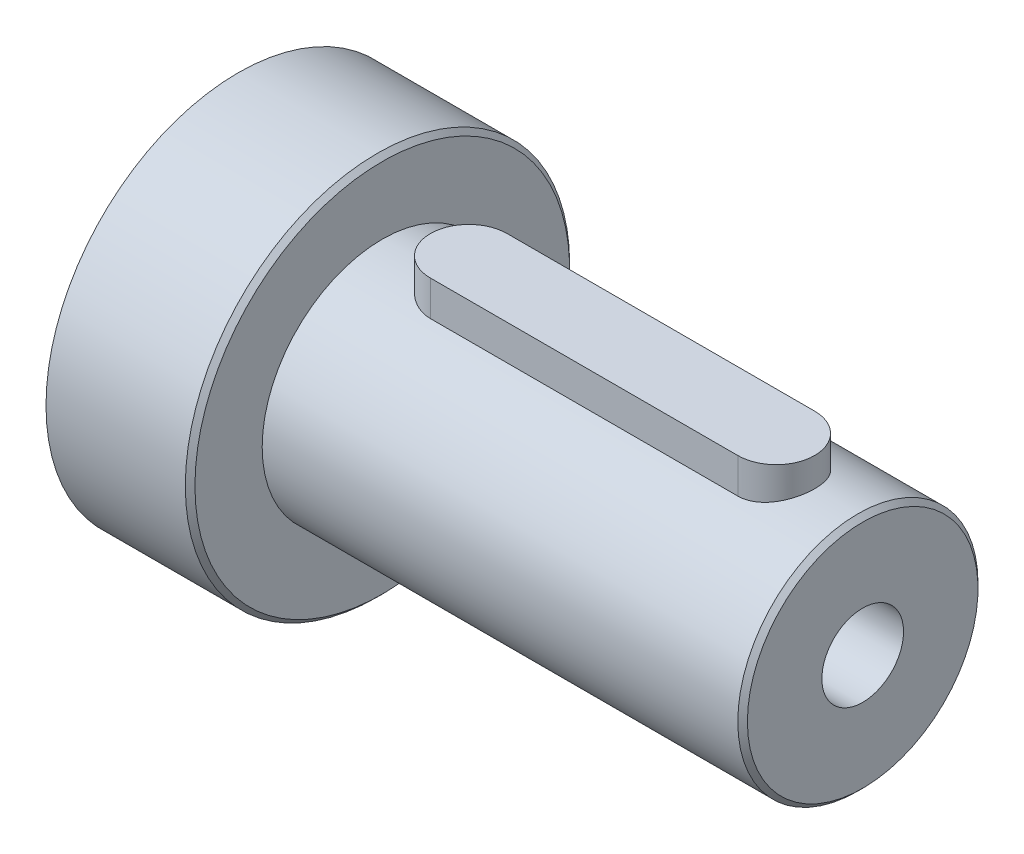
ISO-10303-21;
HEADER;
FILE_DESCRIPTION(('STEP AP214'),'2;1');
FILE_NAME('part.step','',(''),(''),'','','');
FILE_SCHEMA(('AUTOMOTIVE_DESIGN { 1 0 10303 214 1 1 1 1 }'));
ENDSEC;
DATA;
#1=APPLICATION_CONTEXT('core data for automotive mechanical design processes');
#2=APPLICATION_PROTOCOL_DEFINITION('international standard','automotive_design',2000,#1);
#3=PRODUCT_CONTEXT('',#1,'mechanical');
#4=PRODUCT('Part','Part','',(#3));
#5=PRODUCT_RELATED_PRODUCT_CATEGORY('part','',(#4));
#6=PRODUCT_DEFINITION_FORMATION('','',#4);
#7=PRODUCT_DEFINITION_CONTEXT('part definition',#1,'design');
#8=PRODUCT_DEFINITION('design','',#6,#7);
#9=PRODUCT_DEFINITION_SHAPE('','',#8);
#10=(LENGTH_UNIT() NAMED_UNIT(*) SI_UNIT(.MILLI.,.METRE.));
#11=(NAMED_UNIT(*) PLANE_ANGLE_UNIT() SI_UNIT($,.RADIAN.));
#12=(NAMED_UNIT(*) SI_UNIT($,.STERADIAN.) SOLID_ANGLE_UNIT());
#13=UNCERTAINTY_MEASURE_WITH_UNIT(LENGTH_MEASURE(1.E-05),#10,'distance_accuracy_value','');
#14=(GEOMETRIC_REPRESENTATION_CONTEXT(3) GLOBAL_UNCERTAINTY_ASSIGNED_CONTEXT((#13)) GLOBAL_UNIT_ASSIGNED_CONTEXT((#10,
#11,#12)) REPRESENTATION_CONTEXT('',''));
#15=CARTESIAN_POINT('',(0.,0.,0.));
#16=DIRECTION('',(0.,0.,1.));
#17=DIRECTION('',(1.,0.,0.));
#18=AXIS2_PLACEMENT_3D('',#15,#16,#17);
#19=CARTESIAN_POINT('',(41.499999999985,0.,0.));
#20=DIRECTION('',(1.,0.,0.));
#21=DIRECTION('',(0.,0.,-1.));
#22=AXIS2_PLACEMENT_3D('',#19,#20,#21);
#23=CONICAL_SURFACE('',#22,4.25000000001319,1.0297442586776);
#24=CARTESIAN_POINT('',(38.9463423691154,0.,0.));
#25=VERTEX_POINT('',#24);
#26=VERTEX_LOOP('',#25);
#27=FACE_BOUND('',#26,.T.);
#28=CARTESIAN_POINT('',(41.5,0.,0.));
#29=DIRECTION('',(1.,0.,0.));
#30=DIRECTION('',(0.,0.,-1.));
#31=AXIS2_PLACEMENT_3D('',#28,#29,#30);
#32=CIRCLE('',#31,4.25);
#33=CARTESIAN_POINT('',(41.5,0.,-4.25));
#34=VERTEX_POINT('',#33);
#35=EDGE_CURVE('E88',#34,#34,#32,.T.);
#36=ORIENTED_EDGE('',*,*,#35,.T.);
#37=EDGE_LOOP('',(#36));
#38=FACE_BOUND('',#37,.T.);
#39=ADVANCED_FACE('F17',(#27,#38),#23,.F.);
#40=CARTESIAN_POINT('',(0.,0.,0.));
#41=DIRECTION('',(1.,0.,0.));
#42=DIRECTION('',(0.,0.,-1.));
#43=AXIS2_PLACEMENT_3D('',#40,#41,#42);
#44=PLANE('',#43);
#45=CARTESIAN_POINT('',(0.,0.,0.));
#46=DIRECTION('',(-1.,0.,0.));
#47=DIRECTION('',(0.,0.,1.));
#48=AXIS2_PLACEMENT_3D('',#45,#46,#47);
#49=CIRCLE('',#48,20.);
#50=CARTESIAN_POINT('',(0.,0.,20.));
#51=VERTEX_POINT('',#50);
#52=EDGE_CURVE('E20',#51,#51,#49,.F.);
#53=ORIENTED_EDGE('',*,*,#52,.F.);
#54=EDGE_LOOP('',(#53));
#55=FACE_BOUND('',#54,.T.);
#56=ADVANCED_FACE('F156',(#55),#44,.F.);
#57=CARTESIAN_POINT('',(65.,0.,0.));
#58=DIRECTION('',(1.,0.,0.));
#59=DIRECTION('',(0.,0.,-1.));
#60=AXIS2_PLACEMENT_3D('',#57,#58,#59);
#61=CYLINDRICAL_SURFACE('',#60,4.25);
#62=ORIENTED_EDGE('',*,*,#35,.F.);
#63=EDGE_LOOP('',(#62));
#64=FACE_BOUND('',#63,.T.);
#65=CARTESIAN_POINT('',(65.,0.,0.));
#66=DIRECTION('',(1.,0.,0.));
#67=DIRECTION('',(0.,0.,-1.));
#68=AXIS2_PLACEMENT_3D('',#65,#66,#67);
#69=CIRCLE('',#68,4.25);
#70=CARTESIAN_POINT('',(65.,0.,-4.25));
#71=VERTEX_POINT('',#70);
#72=EDGE_CURVE('E66',#71,#71,#69,.T.);
#73=ORIENTED_EDGE('',*,*,#72,.T.);
#74=EDGE_LOOP('',(#73));
#75=FACE_BOUND('',#74,.T.);
#76=ADVANCED_FACE('F159',(#64,#75),#61,.F.);
#77=CARTESIAN_POINT('',(24.,15.5,0.));
#78=DIRECTION('',(0.,1.,0.));
#79=DIRECTION('',(0.,0.,1.));
#80=AXIS2_PLACEMENT_3D('',#77,#78,#79);
#81=PLANE('',#80);
#82=CARTESIAN_POINT('',(56.,15.5,0.));
#83=DIRECTION('',(0.,-1.,0.));
#84=DIRECTION('',(0.,0.,-1.));
#85=AXIS2_PLACEMENT_3D('',#82,#83,#84);
#86=CIRCLE('',#85,4.);
#87=CARTESIAN_POINT('',(56.,15.5,-4.));
#88=VERTEX_POINT('',#87);
#89=CARTESIAN_POINT('',(56.,15.5,4.));
#90=VERTEX_POINT('',#89);
#91=EDGE_CURVE('E78',#88,#90,#86,.T.);
#92=ORIENTED_EDGE('',*,*,#91,.F.);
#93=DIRECTION('',(1.,0.,0.));
#94=VECTOR('',#93,1.);
#95=CARTESIAN_POINT('',(24.,15.5,-4.));
#96=LINE('',#95,#94);
#97=CARTESIAN_POINT('',(24.,15.5,-4.));
#98=VERTEX_POINT('',#97);
#99=EDGE_CURVE('E63',#88,#98,#96,.F.);
#100=ORIENTED_EDGE('',*,*,#99,.T.);
#101=CARTESIAN_POINT('',(24.,15.5,0.));
#102=DIRECTION('',(0.,-1.,0.));
#103=DIRECTION('',(0.,0.,-1.));
#104=AXIS2_PLACEMENT_3D('',#101,#102,#103);
#105=CIRCLE('',#104,4.);
#106=CARTESIAN_POINT('',(24.,15.5,4.));
#107=VERTEX_POINT('',#106);
#108=EDGE_CURVE('E57',#107,#98,#105,.T.);
#109=ORIENTED_EDGE('',*,*,#108,.F.);
#110=DIRECTION('',(-1.,0.,0.));
#111=VECTOR('',#110,1.);
#112=CARTESIAN_POINT('',(24.,15.5,4.));
#113=LINE('',#112,#111);
#114=EDGE_CURVE('E62',#107,#90,#113,.F.);
#115=ORIENTED_EDGE('',*,*,#114,.T.);
#116=EDGE_LOOP('',(#92,#100,#109,#115));
#117=FACE_BOUND('',#116,.T.);
#118=ADVANCED_FACE('F60',(#117),#81,.T.);
#119=CARTESIAN_POINT('',(0.,0.,0.));
#120=DIRECTION('',(-1.,0.,0.));
#121=DIRECTION('',(0.,0.,1.));
#122=AXIS2_PLACEMENT_3D('',#119,#120,#121);
#123=CYLINDRICAL_SURFACE('',#122,20.);
#124=CARTESIAN_POINT('',(14.5,0.,0.));
#125=DIRECTION('',(-1.,0.,0.));
#126=DIRECTION('',(0.,0.,1.));
#127=AXIS2_PLACEMENT_3D('',#124,#125,#126);
#128=CIRCLE('',#127,20.);
#129=CARTESIAN_POINT('',(14.5,0.,20.));
#130=VERTEX_POINT('',#129);
#131=EDGE_CURVE('E75',#130,#130,#128,.F.);
#132=ORIENTED_EDGE('',*,*,#131,.F.);
#133=EDGE_LOOP('',(#132));
#134=FACE_BOUND('',#133,.T.);
#135=ORIENTED_EDGE('',*,*,#52,.T.);
#136=EDGE_LOOP('',(#135));
#137=FACE_BOUND('',#136,.T.);
#138=ADVANCED_FACE('F174',(#134,#137),#123,.T.);
#139=CARTESIAN_POINT('',(65.,12.5,0.));
#140=DIRECTION('',(-1.,0.,0.));
#141=DIRECTION('',(0.,0.,1.));
#142=AXIS2_PLACEMENT_3D('',#139,#140,#141);
#143=PLANE('',#142);
#144=CARTESIAN_POINT('',(65.,0.,0.));
#145=DIRECTION('',(-1.,0.,0.));
#146=DIRECTION('',(0.,0.,1.));
#147=AXIS2_PLACEMENT_3D('',#144,#145,#146);
#148=CIRCLE('',#147,12.);
#149=CARTESIAN_POINT('',(65.,0.,12.));
#150=VERTEX_POINT('',#149);
#151=EDGE_CURVE('E167',#150,#150,#148,.T.);
#152=ORIENTED_EDGE('',*,*,#151,.F.);
#153=EDGE_LOOP('',(#152));
#154=FACE_BOUND('',#153,.T.);
#155=ORIENTED_EDGE('',*,*,#72,.F.);
#156=EDGE_LOOP('',(#155));
#157=FACE_BOUND('',#156,.T.);
#158=ADVANCED_FACE('F177',(#154,#157),#143,.F.);
#159=CARTESIAN_POINT('',(24.,15.5,0.));
#160=DIRECTION('',(0.,-1.,0.));
#161=DIRECTION('',(0.,0.,-1.));
#162=AXIS2_PLACEMENT_3D('',#159,#160,#161);
#163=CYLINDRICAL_SURFACE('',#162,4.);
#164=DIRECTION('',(0.,1.,0.));
#165=VECTOR('',#164,1.);
#166=CARTESIAN_POINT('',(24.,15.5,4.));
#167=LINE('',#166,#165);
#168=CARTESIAN_POINT('',(24.,11.842719282327,4.));
#169=VERTEX_POINT('',#168);
#170=EDGE_CURVE('E69',#169,#107,#167,.T.);
#171=ORIENTED_EDGE('',*,*,#170,.T.);
#172=ORIENTED_EDGE('',*,*,#108,.T.);
#173=DIRECTION('',(0.,1.,0.));
#174=VECTOR('',#173,1.);
#175=CARTESIAN_POINT('',(24.,15.5,-4.));
#176=LINE('',#175,#174);
#177=CARTESIAN_POINT('',(24.,11.842719282327,-4.));
#178=VERTEX_POINT('',#177);
#179=EDGE_CURVE('E87',#98,#178,#176,.F.);
#180=ORIENTED_EDGE('',*,*,#179,.T.);
#181=CARTESIAN_POINT('',(24.,11.842719282327,4.));
#182=CARTESIAN_POINT('',(23.8906002280384,11.8427027366058,4.00001410484613));
#183=CARTESIAN_POINT('',(23.7812097901521,11.8442348052368,3.995512175201));
#184=CARTESIAN_POINT('',(23.5632717592635,11.8502730910574,3.97758606678449));
#185=CARTESIAN_POINT('',(23.4547239615155,11.8547785613244,3.96416412872571));
#186=CARTESIAN_POINT('',(23.2395389691545,11.8666242076309,3.92855725119429));
#187=CARTESIAN_POINT('',(23.1328973043888,11.8739564736691,3.9063967602145));
#188=CARTESIAN_POINT('',(22.9219943616284,11.8912164993788,3.85353581488656));
#189=CARTESIAN_POINT('',(22.8177331598432,11.90114434202,3.82283508754056));
#190=CARTESIAN_POINT('',(22.5096949957216,11.9343840843196,3.71831764495512));
#191=CARTESIAN_POINT('',(22.310363447932,11.9611699822066,3.63203544139887));
#192=CARTESIAN_POINT('',(21.9289874429582,12.0209583955878,3.42895021192288));
#193=CARTESIAN_POINT('',(21.7469526209503,12.0539643457894,3.31213030924909));
#194=CARTESIAN_POINT('',(21.3987460114008,12.123798407807,3.0467850788479));
#195=CARTESIAN_POINT('',(21.2332816756605,12.1607158548651,2.89735303896514));
#196=CARTESIAN_POINT('',(20.9292851514111,12.2334561140966,2.57296449846116));
#197=CARTESIAN_POINT('',(20.7907576516423,12.2692787347869,2.39800356343232));
#198=CARTESIAN_POINT('',(20.5413848016295,12.3368244653945,2.02237003010511));
#199=CARTESIAN_POINT('',(20.4312780435304,12.3684294972003,1.82118394546976));
#200=CARTESIAN_POINT('',(20.2467505046506,12.4229251649937,1.40197197350368));
#201=CARTESIAN_POINT('',(20.1723195262181,12.4458182908278,1.18395091903581));
#202=CARTESIAN_POINT('',(20.0636411357495,12.4796767811416,0.744713961063359));
#203=CARTESIAN_POINT('',(20.0281750666199,12.4910030499338,0.52382792010115));
#204=CARTESIAN_POINT('',(19.9945672009584,12.5017287122873,0.0789648151746337));
#205=CARTESIAN_POINT('',(19.9964172664752,12.5011307063103,-0.145011564197645));
#206=CARTESIAN_POINT('',(20.0365988292713,12.4883236673358,-0.581094974437695));
#207=CARTESIAN_POINT('',(20.0736077679788,12.4765355800409,-0.793338226675241));
#208=CARTESIAN_POINT('',(20.1808805516063,12.443194578958,-1.20842320012721));
#209=CARTESIAN_POINT('',(20.2511462074328,12.4216411334261,-1.41126440871778));
#210=CARTESIAN_POINT('',(20.4237578422358,12.3706364987475,-1.80478548808183));
#211=CARTESIAN_POINT('',(20.5264965198688,12.3410893067347,-1.99528012693527));
#212=CARTESIAN_POINT('',(20.7608290490452,12.2771965403044,-2.35673113106229));
#213=CARTESIAN_POINT('',(20.892430206403,12.2428497517893,-2.52768253275751));
#214=CARTESIAN_POINT('',(21.1874465312916,12.1712409097156,-2.85304511528221));
#215=CARTESIAN_POINT('',(21.3519967025921,12.1339170352569,-3.00641313381737));
#216=CARTESIAN_POINT('',(21.7049719000853,12.0618172896256,-3.28377291775701));
#217=CARTESIAN_POINT('',(21.8934042588322,12.0270422062066,-3.40775562728566));
#218=CARTESIAN_POINT('',(22.1913712377486,11.9796198433082,-3.56958208232607));
#219=CARTESIAN_POINT('',(22.2939990592415,11.9645161845072,-3.61975674493765));
#220=CARTESIAN_POINT('',(22.5034047527517,11.9364591580623,-3.71123075156255));
#221=CARTESIAN_POINT('',(22.6101808877864,11.9235049021446,-3.75253376401034));
#222=CARTESIAN_POINT('',(22.8270133278916,11.9001802342949,-3.82585831579179));
#223=CARTESIAN_POINT('',(22.9370659779731,11.889807055759,-3.85788979915529));
#224=CARTESIAN_POINT('',(23.1596951569476,11.8719756673203,-3.91241790563964));
#225=CARTESIAN_POINT('',(23.2722705037974,11.8645161211931,-3.93491889994975));
#226=CARTESIAN_POINT('',(23.487239245861,11.8533815888388,-3.96832908530803));
#227=CARTESIAN_POINT('',(23.5894674157946,11.8493925948395,-3.9802038456482));
#228=CARTESIAN_POINT('',(23.7944610780333,11.8440568016292,-3.99603937127681));
#229=CARTESIAN_POINT('',(23.8972256382805,11.8427063770563,-4.00001099551563));
#230=CARTESIAN_POINT('',(24.,11.842719282327,-4.));
#231=B_SPLINE_CURVE_WITH_KNOTS('',3,(#181,#182,#183,#184,#185,#186,#187,#188,#189,#190,#191,
#192,#193,#194,#195,#196,#197,#198,#199,#200,#201,#202,#203,#204,#205,#206,#207,#208,#209,#210,
#211,#212,#213,#214,#215,#216,#217,#218,#219,#220,#221,#222,#223,#224,#225,#226,#227,#228,#229,
#230),.UNSPECIFIED.,.F.,.F.,(4,2,2,2,2,2,2,2,2,2,2,2,2,2,2,2,2,2,2,2,2,2,2,2,4),(0.,
0.328080176984104,0.656077971124949,0.983164539368217,1.310261564488,1.96355293984247,
2.61720612481382,3.29209427898756,3.96709980211697,4.65819584662373,5.34909422856993,
6.01770820975086,6.68617638029994,7.3304550155383,7.97476873730065,8.62719320105811,
9.27978300073407,9.96076419384898,10.6419549776068,10.9872862883783,11.3324745283028,
11.6772911585126,12.0219494657669,12.3305938648259,12.6388138912331),.UNSPECIFIED.);
#232=EDGE_CURVE('E72',#169,#178,#231,.T.);
#233=ORIENTED_EDGE('',*,*,#232,.F.);
#234=EDGE_LOOP('',(#171,#172,#180,#233));
#235=FACE_BOUND('',#234,.T.);
#236=ADVANCED_FACE('F70',(#235),#163,.T.);
#237=CARTESIAN_POINT('',(24.,15.5,-4.));
#238=DIRECTION('',(0.,0.,1.));
#239=DIRECTION('',(1.,0.,0.));
#240=AXIS2_PLACEMENT_3D('',#237,#238,#239);
#241=PLANE('',#240);
#242=DIRECTION('',(-1.,0.,0.));
#243=VECTOR('',#242,1.);
#244=CARTESIAN_POINT('',(0.,11.842719282327,-4.));
#245=LINE('',#244,#243);
#246=CARTESIAN_POINT('',(56.,11.842719282327,-4.));
#247=VERTEX_POINT('',#246);
#248=EDGE_CURVE('E104',#178,#247,#245,.F.);
#249=ORIENTED_EDGE('',*,*,#248,.F.);
#250=ORIENTED_EDGE('',*,*,#179,.F.);
#251=ORIENTED_EDGE('',*,*,#99,.F.);
#252=DIRECTION('',(0.,-1.,0.));
#253=VECTOR('',#252,1.);
#254=CARTESIAN_POINT('',(56.,15.5,-4.));
#255=LINE('',#254,#253);
#256=EDGE_CURVE('E81',#247,#88,#255,.F.);
#257=ORIENTED_EDGE('',*,*,#256,.F.);
#258=EDGE_LOOP('',(#249,#250,#251,#257));
#259=FACE_BOUND('',#258,.T.);
#260=ADVANCED_FACE('F137',(#259),#241,.F.);
#261=CARTESIAN_POINT('',(56.,15.5,0.));
#262=DIRECTION('',(0.,-1.,0.));
#263=DIRECTION('',(0.,0.,-1.));
#264=AXIS2_PLACEMENT_3D('',#261,#262,#263);
#265=CYLINDRICAL_SURFACE('',#264,4.);
#266=ORIENTED_EDGE('',*,*,#256,.T.);
#267=ORIENTED_EDGE('',*,*,#91,.T.);
#268=DIRECTION('',(0.,1.,0.));
#269=VECTOR('',#268,1.);
#270=CARTESIAN_POINT('',(56.,15.5,4.));
#271=LINE('',#270,#269);
#272=CARTESIAN_POINT('',(56.,11.842719282327,4.));
#273=VERTEX_POINT('',#272);
#274=EDGE_CURVE('E35',#90,#273,#271,.F.);
#275=ORIENTED_EDGE('',*,*,#274,.T.);
#276=CARTESIAN_POINT('',(56.,11.842719282327,-4.));
#277=CARTESIAN_POINT('',(56.1093997719616,11.8427027366058,-4.00001410484613));
#278=CARTESIAN_POINT('',(56.2187902098479,11.8442348052368,-3.995512175201));
#279=CARTESIAN_POINT('',(56.4367282407365,11.8502730910574,-3.97758606678449));
#280=CARTESIAN_POINT('',(56.5452760384845,11.8547785613244,-3.96416412872571));
#281=CARTESIAN_POINT('',(56.7604610308455,11.8666242076309,-3.92855725119429));
#282=CARTESIAN_POINT('',(56.8671026956112,11.8739564736691,-3.9063967602145));
#283=CARTESIAN_POINT('',(57.0780056383716,11.8912164993788,-3.85353581488656));
#284=CARTESIAN_POINT('',(57.1822668401568,11.90114434202,-3.82283508754056));
#285=CARTESIAN_POINT('',(57.4903050042784,11.9343840843196,-3.71831764495512));
#286=CARTESIAN_POINT('',(57.689636552068,11.9611699822066,-3.63203544139887));
#287=CARTESIAN_POINT('',(58.0710125570418,12.0209583955878,-3.42895021192288));
#288=CARTESIAN_POINT('',(58.2530473790497,12.0539643457894,-3.31213030924909));
#289=CARTESIAN_POINT('',(58.6012539885992,12.123798407807,-3.0467850788479));
#290=CARTESIAN_POINT('',(58.7667183243395,12.1607158548651,-2.89735303896514));
#291=CARTESIAN_POINT('',(59.0707148485889,12.2334561140966,-2.57296449846116));
#292=CARTESIAN_POINT('',(59.2092423483577,12.2692787347869,-2.39800356343233));
#293=CARTESIAN_POINT('',(59.4586151983705,12.3368244653945,-2.02237003010512));
#294=CARTESIAN_POINT('',(59.5687219564696,12.3684294972003,-1.82118394546977));
#295=CARTESIAN_POINT('',(59.7532494953494,12.4229251649937,-1.40197197350369));
#296=CARTESIAN_POINT('',(59.8276804737819,12.4458182908278,-1.18395091903582));
#297=CARTESIAN_POINT('',(59.9363588642505,12.4796767811416,-0.744713961063372));
#298=CARTESIAN_POINT('',(59.9718249333801,12.4910030499338,-0.523827920101162));
#299=CARTESIAN_POINT('',(60.0054327990416,12.5017287122873,-0.0789648151746443));
#300=CARTESIAN_POINT('',(60.0035827335248,12.5011307063103,0.145011564197635));
#301=CARTESIAN_POINT('',(59.9634011707287,12.4883236673358,0.581094974437684));
#302=CARTESIAN_POINT('',(59.9263922320212,12.4765355800409,0.793338226675231));
#303=CARTESIAN_POINT('',(59.8191194483937,12.443194578958,1.2084232001272));
#304=CARTESIAN_POINT('',(59.7488537925672,12.4216411334261,1.41126440871777));
#305=CARTESIAN_POINT('',(59.5762421577642,12.3706364987475,1.80478548808182));
#306=CARTESIAN_POINT('',(59.4735034801312,12.3410893067347,1.99528012693526));
#307=CARTESIAN_POINT('',(59.2391709509548,12.2771965403044,2.35673113106228));
#308=CARTESIAN_POINT('',(59.107569793597,12.2428497517893,2.5276825327575));
#309=CARTESIAN_POINT('',(58.8125534687085,12.1712409097156,2.8530451152822));
#310=CARTESIAN_POINT('',(58.6480032974079,12.1339170352569,3.00641313381737));
#311=CARTESIAN_POINT('',(58.2950280999147,12.0618172896256,3.28377291775701));
#312=CARTESIAN_POINT('',(58.1065957411679,12.0270422062066,3.40775562728565));
#313=CARTESIAN_POINT('',(57.8086287622514,11.9796198433082,3.56958208232606));
#314=CARTESIAN_POINT('',(57.7060009407585,11.9645161845072,3.61975674493764));
#315=CARTESIAN_POINT('',(57.4965952472483,11.9364591580623,3.71123075156255));
#316=CARTESIAN_POINT('',(57.3898191122136,11.9235049021446,3.75253376401033));
#317=CARTESIAN_POINT('',(57.1729866721084,11.9001802342949,3.82585831579178));
#318=CARTESIAN_POINT('',(57.0629340220269,11.889807055759,3.85788979915528));
#319=CARTESIAN_POINT('',(56.8403048430524,11.8719756673203,3.91241790563964));
#320=CARTESIAN_POINT('',(56.7277294962026,11.8645161211931,3.93491889994975));
#321=CARTESIAN_POINT('',(56.512760754139,11.8533815888388,3.96832908530803));
#322=CARTESIAN_POINT('',(56.4105325842054,11.8493925948395,3.9802038456482));
#323=CARTESIAN_POINT('',(56.2055389219667,11.8440568016292,3.99603937127681));
#324=CARTESIAN_POINT('',(56.1027743617195,11.8427063770563,4.00001099551563));
#325=CARTESIAN_POINT('',(56.,11.842719282327,4.));
#326=B_SPLINE_CURVE_WITH_KNOTS('',3,(#276,#277,#278,#279,#280,#281,#282,#283,#284,#285,#286,
#287,#288,#289,#290,#291,#292,#293,#294,#295,#296,#297,#298,#299,#300,#301,#302,#303,#304,#305,
#306,#307,#308,#309,#310,#311,#312,#313,#314,#315,#316,#317,#318,#319,#320,#321,#322,#323,#324,
#325),.UNSPECIFIED.,.F.,.F.,(4,2,2,2,2,2,2,2,2,2,2,2,2,2,2,2,2,2,2,2,2,2,2,2,4),(0.,
0.328080176984104,0.656077971124949,0.983164539368213,1.31026156448799,1.96355293984247,
2.61720612481382,3.29209427898756,3.96709980211696,4.65819584662372,5.34909422856992,
6.01770820975085,6.68617638029993,7.33045501553829,7.97476873730064,8.6271932010581,
9.27978300073406,9.96076419384897,10.6419549776068,10.9872862883783,11.3324745283028,
11.6772911585126,12.0219494657669,12.3305938648259,12.6388138912331),.UNSPECIFIED.);
#327=EDGE_CURVE('E95',#247,#273,#326,.T.);
#328=ORIENTED_EDGE('',*,*,#327,.F.);
#329=EDGE_LOOP('',(#266,#267,#275,#328));
#330=FACE_BOUND('',#329,.T.);
#331=ADVANCED_FACE('F111',(#330),#265,.T.);
#332=CARTESIAN_POINT('',(24.,15.5,4.));
#333=DIRECTION('',(0.,0.,-1.));
#334=DIRECTION('',(-1.,0.,0.));
#335=AXIS2_PLACEMENT_3D('',#332,#333,#334);
#336=PLANE('',#335);
#337=DIRECTION('',(-1.,0.,0.));
#338=VECTOR('',#337,1.);
#339=CARTESIAN_POINT('',(0.,11.842719282327,4.));
#340=LINE('',#339,#338);
#341=EDGE_CURVE('E94',#273,#169,#340,.T.);
#342=ORIENTED_EDGE('',*,*,#341,.F.);
#343=ORIENTED_EDGE('',*,*,#274,.F.);
#344=ORIENTED_EDGE('',*,*,#114,.F.);
#345=ORIENTED_EDGE('',*,*,#170,.F.);
#346=EDGE_LOOP('',(#342,#343,#344,#345));
#347=FACE_BOUND('',#346,.T.);
#348=ADVANCED_FACE('F77',(#347),#336,.F.);
#349=CARTESIAN_POINT('',(14.5,0.,0.));
#350=DIRECTION('',(-1.,0.,0.));
#351=DIRECTION('',(0.,0.,1.));
#352=AXIS2_PLACEMENT_3D('',#349,#350,#351);
#353=CONICAL_SURFACE('',#352,20.,0.785398163397448);
#354=CARTESIAN_POINT('',(15.,0.,0.));
#355=DIRECTION('',(-1.,0.,0.));
#356=DIRECTION('',(0.,0.,1.));
#357=AXIS2_PLACEMENT_3D('',#354,#355,#356);
#358=CIRCLE('',#357,19.5);
#359=CARTESIAN_POINT('',(15.,0.,19.5));
#360=VERTEX_POINT('',#359);
#361=EDGE_CURVE('E91',#360,#360,#358,.T.);
#362=ORIENTED_EDGE('',*,*,#361,.T.);
#363=EDGE_LOOP('',(#362));
#364=FACE_BOUND('',#363,.T.);
#365=ORIENTED_EDGE('',*,*,#131,.T.);
#366=EDGE_LOOP('',(#365));
#367=FACE_BOUND('',#366,.T.);
#368=ADVANCED_FACE('F128',(#364,#367),#353,.T.);
#369=CARTESIAN_POINT('',(64.5,0.,0.));
#370=DIRECTION('',(-1.,0.,0.));
#371=DIRECTION('',(0.,0.,1.));
#372=AXIS2_PLACEMENT_3D('',#369,#370,#371);
#373=CONICAL_SURFACE('',#372,12.5,0.785398163397438);
#374=ORIENTED_EDGE('',*,*,#151,.T.);
#375=EDGE_LOOP('',(#374));
#376=FACE_BOUND('',#375,.T.);
#377=CARTESIAN_POINT('',(64.5,0.,0.));
#378=DIRECTION('',(-1.,0.,0.));
#379=DIRECTION('',(0.,0.,1.));
#380=AXIS2_PLACEMENT_3D('',#377,#378,#379);
#381=CIRCLE('',#380,12.5);
#382=CARTESIAN_POINT('',(64.5,0.,12.5));
#383=VERTEX_POINT('',#382);
#384=EDGE_CURVE('E26',#383,#383,#381,.T.);
#385=ORIENTED_EDGE('',*,*,#384,.F.);
#386=EDGE_LOOP('',(#385));
#387=FACE_BOUND('',#386,.T.);
#388=ADVANCED_FACE('F124',(#376,#387),#373,.T.);
#389=CARTESIAN_POINT('',(15.,20.,0.));
#390=DIRECTION('',(-1.,0.,0.));
#391=DIRECTION('',(0.,0.,1.));
#392=AXIS2_PLACEMENT_3D('',#389,#390,#391);
#393=PLANE('',#392);
#394=CARTESIAN_POINT('',(15.,0.,0.));
#395=DIRECTION('',(-1.,0.,0.));
#396=DIRECTION('',(0.,0.,1.));
#397=AXIS2_PLACEMENT_3D('',#394,#395,#396);
#398=CIRCLE('',#397,12.5);
#399=CARTESIAN_POINT('',(15.,0.,12.5));
#400=VERTEX_POINT('',#399);
#401=EDGE_CURVE('E11',#400,#400,#398,.F.);
#402=ORIENTED_EDGE('',*,*,#401,.F.);
#403=EDGE_LOOP('',(#402));
#404=FACE_BOUND('',#403,.T.);
#405=ORIENTED_EDGE('',*,*,#361,.F.);
#406=EDGE_LOOP('',(#405));
#407=FACE_BOUND('',#406,.T.);
#408=ADVANCED_FACE('F119',(#404,#407),#393,.F.);
#409=CARTESIAN_POINT('',(0.,0.,0.));
#410=DIRECTION('',(-1.,0.,0.));
#411=DIRECTION('',(0.,0.,1.));
#412=AXIS2_PLACEMENT_3D('',#409,#410,#411);
#413=CYLINDRICAL_SURFACE('',#412,12.5);
#414=ORIENTED_EDGE('',*,*,#384,.T.);
#415=EDGE_LOOP('',(#414));
#416=FACE_BOUND('',#415,.T.);
#417=ORIENTED_EDGE('',*,*,#401,.T.);
#418=EDGE_LOOP('',(#417));
#419=FACE_BOUND('',#418,.T.);
#420=ORIENTED_EDGE('',*,*,#327,.T.);
#421=ORIENTED_EDGE('',*,*,#341,.T.);
#422=ORIENTED_EDGE('',*,*,#232,.T.);
#423=ORIENTED_EDGE('',*,*,#248,.T.);
#424=EDGE_LOOP('',(#420,#421,#422,#423));
#425=FACE_BOUND('',#424,.T.);
#426=ADVANCED_FACE('F115',(#416,#419,#425),#413,.T.);
#427=CLOSED_SHELL('',(#39,#56,#76,#118,#138,#158,#236,#260,#331,#348,#368,#388,#408,#426));
#428=MANIFOLD_SOLID_BREP('B1',#427);
#429=ADVANCED_BREP_SHAPE_REPRESENTATION('',(#18,#428),#14);
#430=SHAPE_DEFINITION_REPRESENTATION(#9,#429);
ENDSEC;
END-ISO-10303-21;
